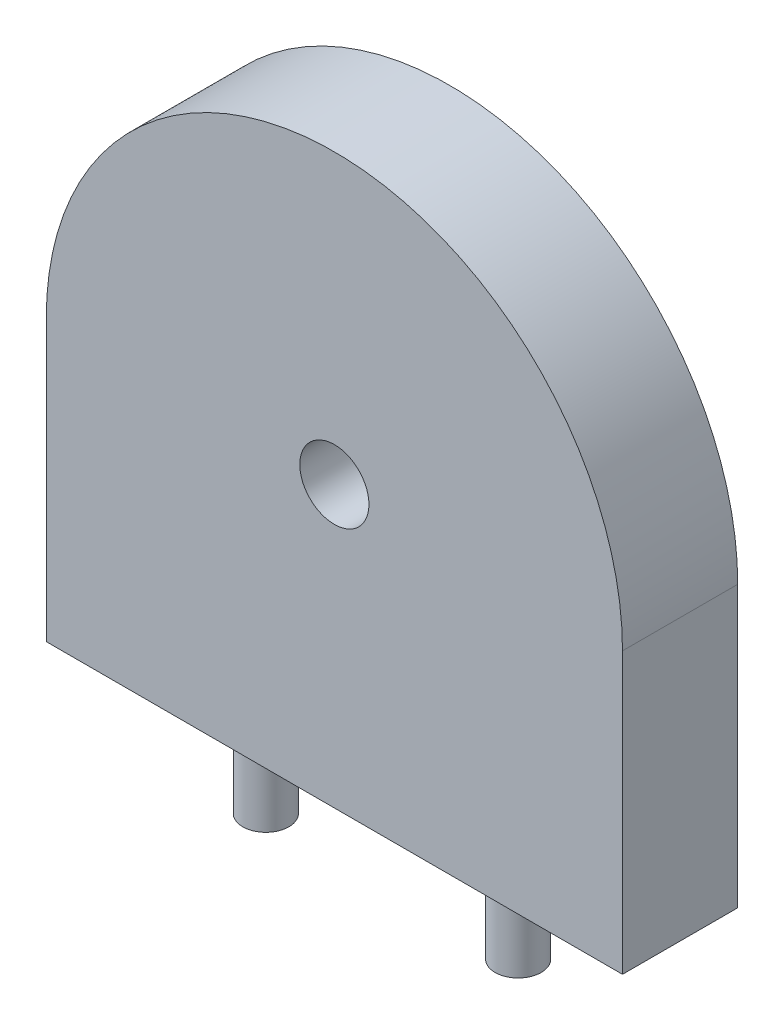
ISO-10303-21;
HEADER;
FILE_DESCRIPTION(('STEP AP214'),'2;1');
FILE_NAME('part.step','',(''),(''),'','','');
FILE_SCHEMA(('AUTOMOTIVE_DESIGN { 1 0 10303 214 1 1 1 1 }'));
ENDSEC;
DATA;
#1=APPLICATION_CONTEXT('core data for automotive mechanical design processes');
#2=APPLICATION_PROTOCOL_DEFINITION('international standard','automotive_design',2000,#1);
#3=PRODUCT_CONTEXT('',#1,'mechanical');
#4=PRODUCT('Part','Part','',(#3));
#5=PRODUCT_RELATED_PRODUCT_CATEGORY('part','',(#4));
#6=PRODUCT_DEFINITION_FORMATION('','',#4);
#7=PRODUCT_DEFINITION_CONTEXT('part definition',#1,'design');
#8=PRODUCT_DEFINITION('design','',#6,#7);
#9=PRODUCT_DEFINITION_SHAPE('','',#8);
#10=(LENGTH_UNIT() NAMED_UNIT(*) SI_UNIT(.MILLI.,.METRE.));
#11=(NAMED_UNIT(*) PLANE_ANGLE_UNIT() SI_UNIT($,.RADIAN.));
#12=(NAMED_UNIT(*) SI_UNIT($,.STERADIAN.) SOLID_ANGLE_UNIT());
#13=UNCERTAINTY_MEASURE_WITH_UNIT(LENGTH_MEASURE(1.E-05),#10,'distance_accuracy_value','');
#14=(GEOMETRIC_REPRESENTATION_CONTEXT(3) GLOBAL_UNCERTAINTY_ASSIGNED_CONTEXT((#13)) GLOBAL_UNIT_ASSIGNED_CONTEXT((#10,
#11,#12)) REPRESENTATION_CONTEXT('',''));
#15=CARTESIAN_POINT('',(0.,0.,0.));
#16=DIRECTION('',(0.,0.,1.));
#17=DIRECTION('',(1.,0.,0.));
#18=AXIS2_PLACEMENT_3D('',#15,#16,#17);
#19=CARTESIAN_POINT('',(0.,12.35,10.));
#20=DIRECTION('',(0.,0.,-1.));
#21=DIRECTION('',(-1.,0.,0.));
#22=AXIS2_PLACEMENT_3D('',#19,#20,#21);
#23=PLANE('',#22);
#24=DIRECTION('',(0.,-1.,0.));
#25=VECTOR('',#24,1.);
#26=CARTESIAN_POINT('',(-25.,-12.35,10.));
#27=LINE('',#26,#25);
#28=CARTESIAN_POINT('',(-25.,12.35,10.));
#29=VERTEX_POINT('',#28);
#30=CARTESIAN_POINT('',(-25.,-11.96,10.));
#31=VERTEX_POINT('',#30);
#32=EDGE_CURVE('E121',#29,#31,#27,.T.);
#33=ORIENTED_EDGE('',*,*,#32,.T.);
#34=DIRECTION('',(-1.,0.,0.));
#35=VECTOR('',#34,1.);
#36=CARTESIAN_POINT('',(-25.,-11.96,10.));
#37=LINE('',#36,#35);
#38=CARTESIAN_POINT('',(25.,-11.96,10.));
#39=VERTEX_POINT('',#38);
#40=EDGE_CURVE('E131',#39,#31,#37,.T.);
#41=ORIENTED_EDGE('',*,*,#40,.F.);
#42=DIRECTION('',(0.,1.,0.));
#43=VECTOR('',#42,1.);
#44=CARTESIAN_POINT('',(25.,-12.35,10.));
#45=LINE('',#44,#43);
#46=CARTESIAN_POINT('',(25.,12.35,10.));
#47=VERTEX_POINT('',#46);
#48=EDGE_CURVE('E118',#39,#47,#45,.T.);
#49=ORIENTED_EDGE('',*,*,#48,.T.);
#50=CARTESIAN_POINT('',(0.,12.35,10.));
#51=DIRECTION('',(0.,0.,1.));
#52=DIRECTION('',(-1.,0.,0.));
#53=AXIS2_PLACEMENT_3D('',#50,#51,#52);
#54=CIRCLE('',#53,25.);
#55=EDGE_CURVE('E101',#47,#29,#54,.T.);
#56=ORIENTED_EDGE('',*,*,#55,.T.);
#57=EDGE_LOOP('',(#33,#41,#49,#56));
#58=FACE_BOUND('',#57,.T.);
#59=CARTESIAN_POINT('',(0.,12.35,10.));
#60=DIRECTION('',(0.,0.,1.));
#61=DIRECTION('',(1.,0.,0.));
#62=AXIS2_PLACEMENT_3D('',#59,#60,#61);
#63=CIRCLE('',#62,3.);
#64=CARTESIAN_POINT('',(2.99999999999999,12.35,10.));
#65=VERTEX_POINT('',#64);
#66=EDGE_CURVE('E92',#65,#65,#63,.T.);
#67=ORIENTED_EDGE('',*,*,#66,.F.);
#68=EDGE_LOOP('',(#67));
#69=FACE_BOUND('',#68,.T.);
#70=ADVANCED_FACE('F45',(#58,#69),#23,.F.);
#71=CARTESIAN_POINT('',(0.,12.35,0.));
#72=DIRECTION('',(0.,0.,-1.));
#73=DIRECTION('',(-1.,0.,0.));
#74=AXIS2_PLACEMENT_3D('',#71,#72,#73);
#75=PLANE('',#74);
#76=DIRECTION('',(-1.,0.,0.));
#77=VECTOR('',#76,1.);
#78=CARTESIAN_POINT('',(-25.,-11.96,0.));
#79=LINE('',#78,#77);
#80=CARTESIAN_POINT('',(25.,-11.96,0.));
#81=VERTEX_POINT('',#80);
#82=CARTESIAN_POINT('',(-25.,-11.96,0.));
#83=VERTEX_POINT('',#82);
#84=EDGE_CURVE('E114',#81,#83,#79,.T.);
#85=ORIENTED_EDGE('',*,*,#84,.T.);
#86=DIRECTION('',(0.,-1.,0.));
#87=VECTOR('',#86,1.);
#88=CARTESIAN_POINT('',(-25.,-12.35,0.));
#89=LINE('',#88,#87);
#90=CARTESIAN_POINT('',(-25.,12.35,0.));
#91=VERTEX_POINT('',#90);
#92=EDGE_CURVE('E103',#91,#83,#89,.T.);
#93=ORIENTED_EDGE('',*,*,#92,.F.);
#94=CARTESIAN_POINT('',(0.,12.35,0.));
#95=DIRECTION('',(0.,0.,1.));
#96=DIRECTION('',(-1.,0.,0.));
#97=AXIS2_PLACEMENT_3D('',#94,#95,#96);
#98=CIRCLE('',#97,25.);
#99=CARTESIAN_POINT('',(25.,12.35,0.));
#100=VERTEX_POINT('',#99);
#101=EDGE_CURVE('E99',#100,#91,#98,.T.);
#102=ORIENTED_EDGE('',*,*,#101,.F.);
#103=DIRECTION('',(0.,1.,0.));
#104=VECTOR('',#103,1.);
#105=CARTESIAN_POINT('',(25.,-12.35,0.));
#106=LINE('',#105,#104);
#107=EDGE_CURVE('E82',#81,#100,#106,.T.);
#108=ORIENTED_EDGE('',*,*,#107,.F.);
#109=EDGE_LOOP('',(#85,#93,#102,#108));
#110=FACE_BOUND('',#109,.T.);
#111=CARTESIAN_POINT('',(0.,12.35,0.));
#112=DIRECTION('',(0.,0.,1.));
#113=DIRECTION('',(1.,0.,0.));
#114=AXIS2_PLACEMENT_3D('',#111,#112,#113);
#115=CIRCLE('',#114,3.);
#116=CARTESIAN_POINT('',(2.99999999999999,12.35,0.));
#117=VERTEX_POINT('',#116);
#118=EDGE_CURVE('E110',#117,#117,#115,.T.);
#119=ORIENTED_EDGE('',*,*,#118,.T.);
#120=EDGE_LOOP('',(#119));
#121=FACE_BOUND('',#120,.T.);
#122=ADVANCED_FACE('F105',(#110,#121),#75,.T.);
#123=CARTESIAN_POINT('',(0.,12.35,10.));
#124=DIRECTION('',(0.,0.,-1.));
#125=DIRECTION('',(-1.,0.,0.));
#126=AXIS2_PLACEMENT_3D('',#123,#124,#125);
#127=CYLINDRICAL_SURFACE('',#126,25.);
#128=ORIENTED_EDGE('',*,*,#101,.T.);
#129=DIRECTION('',(0.,0.,-1.));
#130=VECTOR('',#129,1.);
#131=CARTESIAN_POINT('',(-25.,12.35,10.));
#132=LINE('',#131,#130);
#133=EDGE_CURVE('E93',#29,#91,#132,.T.);
#134=ORIENTED_EDGE('',*,*,#133,.F.);
#135=ORIENTED_EDGE('',*,*,#55,.F.);
#136=DIRECTION('',(0.,0.,-1.));
#137=VECTOR('',#136,1.);
#138=CARTESIAN_POINT('',(25.,12.35,10.));
#139=LINE('',#138,#137);
#140=EDGE_CURVE('E86',#47,#100,#139,.T.);
#141=ORIENTED_EDGE('',*,*,#140,.T.);
#142=EDGE_LOOP('',(#128,#134,#135,#141));
#143=FACE_BOUND('',#142,.T.);
#144=ADVANCED_FACE('F97',(#143),#127,.T.);
#145=CARTESIAN_POINT('',(-25.,-12.35,10.));
#146=DIRECTION('',(1.,0.,0.));
#147=DIRECTION('',(0.,0.,-1.));
#148=AXIS2_PLACEMENT_3D('',#145,#146,#147);
#149=PLANE('',#148);
#150=ORIENTED_EDGE('',*,*,#92,.T.);
#151=DIRECTION('',(0.,0.,1.));
#152=VECTOR('',#151,1.);
#153=CARTESIAN_POINT('',(-25.,-11.96,0.));
#154=LINE('',#153,#152);
#155=EDGE_CURVE('E134',#83,#31,#154,.T.);
#156=ORIENTED_EDGE('',*,*,#155,.T.);
#157=ORIENTED_EDGE('',*,*,#32,.F.);
#158=ORIENTED_EDGE('',*,*,#133,.T.);
#159=EDGE_LOOP('',(#150,#156,#157,#158));
#160=FACE_BOUND('',#159,.T.);
#161=ADVANCED_FACE('F153',(#160),#149,.F.);
#162=CARTESIAN_POINT('',(25.,-12.35,10.));
#163=DIRECTION('',(-1.,0.,0.));
#164=DIRECTION('',(0.,0.,1.));
#165=AXIS2_PLACEMENT_3D('',#162,#163,#164);
#166=PLANE('',#165);
#167=ORIENTED_EDGE('',*,*,#48,.F.);
#168=DIRECTION('',(0.,0.,1.));
#169=VECTOR('',#168,1.);
#170=CARTESIAN_POINT('',(25.,-11.96,0.));
#171=LINE('',#170,#169);
#172=EDGE_CURVE('E62',#81,#39,#171,.T.);
#173=ORIENTED_EDGE('',*,*,#172,.F.);
#174=ORIENTED_EDGE('',*,*,#107,.T.);
#175=ORIENTED_EDGE('',*,*,#140,.F.);
#176=EDGE_LOOP('',(#167,#173,#174,#175));
#177=FACE_BOUND('',#176,.T.);
#178=ADVANCED_FACE('F85',(#177),#166,.F.);
#179=CARTESIAN_POINT('',(0.,12.35,10.));
#180=DIRECTION('',(0.,0.,-1.));
#181=DIRECTION('',(-1.,0.,0.));
#182=AXIS2_PLACEMENT_3D('',#179,#180,#181);
#183=CYLINDRICAL_SURFACE('',#182,3.);
#184=ORIENTED_EDGE('',*,*,#66,.T.);
#185=EDGE_LOOP('',(#184));
#186=FACE_BOUND('',#185,.T.);
#187=ORIENTED_EDGE('',*,*,#118,.F.);
#188=EDGE_LOOP('',(#187));
#189=FACE_BOUND('',#188,.T.);
#190=ADVANCED_FACE('F148',(#186,#189),#183,.F.);
#191=CARTESIAN_POINT('',(-25.,-11.96,0.));
#192=DIRECTION('',(0.,1.,0.));
#193=DIRECTION('',(0.,0.,1.));
#194=AXIS2_PLACEMENT_3D('',#191,#192,#193);
#195=PLANE('',#194);
#196=CARTESIAN_POINT('',(10.9460049599591,-11.96,5.00000000000002));
#197=DIRECTION('',(0.,1.,0.));
#198=DIRECTION('',(0.,0.,1.));
#199=AXIS2_PLACEMENT_3D('',#196,#197,#198);
#200=CIRCLE('',#199,2.);
#201=CARTESIAN_POINT('',(10.9460049599591,-11.96,7.00000000000001));
#202=VERTEX_POINT('',#201);
#203=EDGE_CURVE('E11',#202,#202,#200,.F.);
#204=ORIENTED_EDGE('',*,*,#203,.F.);
#205=EDGE_LOOP('',(#204));
#206=FACE_BOUND('',#205,.T.);
#207=CARTESIAN_POINT('',(-10.9460049599591,-11.96,5.));
#208=DIRECTION('',(0.,1.,0.));
#209=DIRECTION('',(0.,0.,1.));
#210=AXIS2_PLACEMENT_3D('',#207,#208,#209);
#211=CIRCLE('',#210,2.);
#212=CARTESIAN_POINT('',(-10.9460049599591,-11.96,7.));
#213=VERTEX_POINT('',#212);
#214=EDGE_CURVE('E55',#213,#213,#211,.F.);
#215=ORIENTED_EDGE('',*,*,#214,.F.);
#216=EDGE_LOOP('',(#215));
#217=FACE_BOUND('',#216,.T.);
#218=ORIENTED_EDGE('',*,*,#40,.T.);
#219=ORIENTED_EDGE('',*,*,#155,.F.);
#220=ORIENTED_EDGE('',*,*,#84,.F.);
#221=ORIENTED_EDGE('',*,*,#172,.T.);
#222=EDGE_LOOP('',(#218,#219,#220,#221));
#223=FACE_BOUND('',#222,.T.);
#224=ADVANCED_FACE('F47',(#206,#217,#223),#195,.F.);
#225=CARTESIAN_POINT('',(-10.9460049599591,-26.0068542494924,5.));
#226=DIRECTION('',(0.,1.,0.));
#227=DIRECTION('',(0.,0.,1.));
#228=AXIS2_PLACEMENT_3D('',#225,#226,#227);
#229=CYLINDRICAL_SURFACE('',#228,2.);
#230=CARTESIAN_POINT('',(-10.9460049599591,-20.35,5.));
#231=DIRECTION('',(0.,-1.,0.));
#232=DIRECTION('',(0.,0.,-1.));
#233=AXIS2_PLACEMENT_3D('',#230,#231,#232);
#234=CIRCLE('',#233,2.);
#235=CARTESIAN_POINT('',(-10.9460049599591,-20.35,3.));
#236=VERTEX_POINT('',#235);
#237=EDGE_CURVE('E125',#236,#236,#234,.T.);
#238=ORIENTED_EDGE('',*,*,#237,.F.);
#239=EDGE_LOOP('',(#238));
#240=FACE_BOUND('',#239,.T.);
#241=ORIENTED_EDGE('',*,*,#214,.T.);
#242=EDGE_LOOP('',(#241));
#243=FACE_BOUND('',#242,.T.);
#244=ADVANCED_FACE('F145',(#240,#243),#229,.T.);
#245=CARTESIAN_POINT('',(-10.9460049599591,-20.35,5.));
#246=DIRECTION('',(0.,-1.,0.));
#247=DIRECTION('',(0.,0.,-1.));
#248=AXIS2_PLACEMENT_3D('',#245,#246,#247);
#249=PLANE('',#248);
#250=ORIENTED_EDGE('',*,*,#237,.T.);
#251=EDGE_LOOP('',(#250));
#252=FACE_BOUND('',#251,.T.);
#253=ADVANCED_FACE('F171',(#252),#249,.T.);
#254=CARTESIAN_POINT('',(10.9460049599591,-26.0068542494924,5.00000000000002));
#255=DIRECTION('',(0.,1.,0.));
#256=DIRECTION('',(0.,0.,1.));
#257=AXIS2_PLACEMENT_3D('',#254,#255,#256);
#258=CYLINDRICAL_SURFACE('',#257,2.);
#259=CARTESIAN_POINT('',(10.9460049599591,-20.35,5.00000000000002));
#260=DIRECTION('',(0.,-1.,0.));
#261=DIRECTION('',(0.,0.,-1.));
#262=AXIS2_PLACEMENT_3D('',#259,#260,#261);
#263=CIRCLE('',#262,2.);
#264=CARTESIAN_POINT('',(10.9460049599591,-20.35,3.00000000000002));
#265=VERTEX_POINT('',#264);
#266=EDGE_CURVE('E161',#265,#265,#263,.T.);
#267=ORIENTED_EDGE('',*,*,#266,.F.);
#268=EDGE_LOOP('',(#267));
#269=FACE_BOUND('',#268,.T.);
#270=ORIENTED_EDGE('',*,*,#203,.T.);
#271=EDGE_LOOP('',(#270));
#272=FACE_BOUND('',#271,.T.);
#273=ADVANCED_FACE('F168',(#269,#272),#258,.T.);
#274=CARTESIAN_POINT('',(-10.9460049599591,-20.35,5.));
#275=DIRECTION('',(0.,-1.,0.));
#276=DIRECTION('',(0.,0.,-1.));
#277=AXIS2_PLACEMENT_3D('',#274,#275,#276);
#278=PLANE('',#277);
#279=ORIENTED_EDGE('',*,*,#266,.T.);
#280=EDGE_LOOP('',(#279));
#281=FACE_BOUND('',#280,.T.);
#282=ADVANCED_FACE('F166',(#281),#278,.T.);
#283=CLOSED_SHELL('',(#70,#122,#144,#161,#178,#190,#224,#244,#253,#273,#282));
#284=MANIFOLD_SOLID_BREP('B2',#283);
#285=ADVANCED_BREP_SHAPE_REPRESENTATION('',(#18,#284),#14);
#286=SHAPE_DEFINITION_REPRESENTATION(#9,#285);
ENDSEC;
END-ISO-10303-21;
